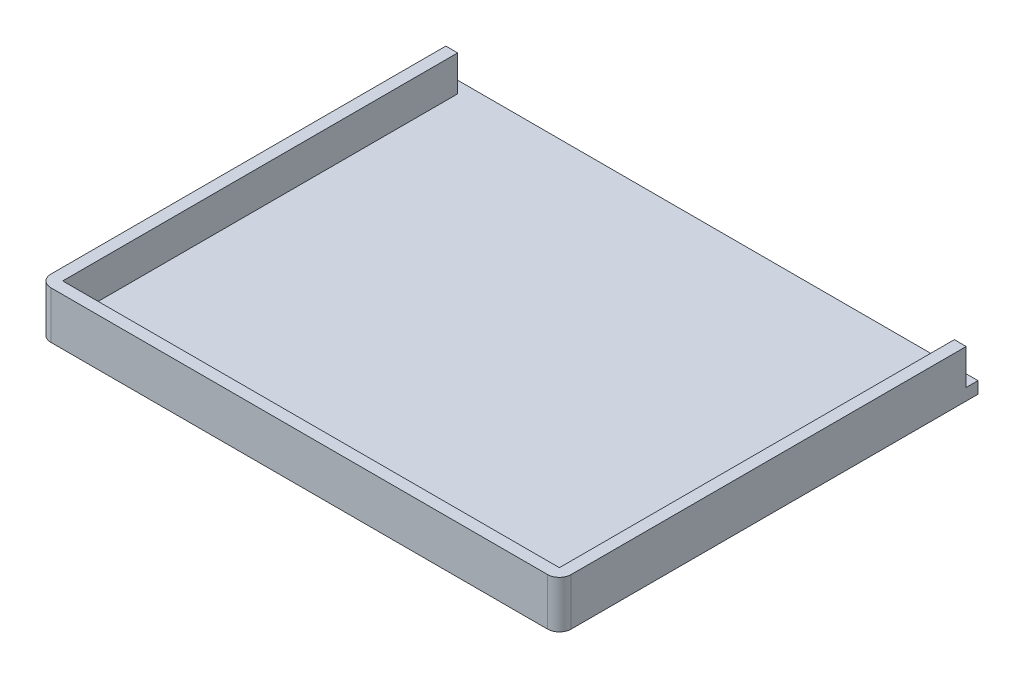
ISO-10303-21;
HEADER;
FILE_DESCRIPTION(('STEP AP214'),'2;1');
FILE_NAME('part.step','',(''),(''),'','','');
FILE_SCHEMA(('AUTOMOTIVE_DESIGN { 1 0 10303 214 1 1 1 1 }'));
ENDSEC;
DATA;
#1=APPLICATION_CONTEXT('core data for automotive mechanical design processes');
#2=APPLICATION_PROTOCOL_DEFINITION('international standard','automotive_design',2000,#1);
#3=PRODUCT_CONTEXT('',#1,'mechanical');
#4=PRODUCT('Part','Part','',(#3));
#5=PRODUCT_RELATED_PRODUCT_CATEGORY('part','',(#4));
#6=PRODUCT_DEFINITION_FORMATION('','',#4);
#7=PRODUCT_DEFINITION_CONTEXT('part definition',#1,'design');
#8=PRODUCT_DEFINITION('design','',#6,#7);
#9=PRODUCT_DEFINITION_SHAPE('','',#8);
#10=(LENGTH_UNIT() NAMED_UNIT(*) SI_UNIT(.MILLI.,.METRE.));
#11=(NAMED_UNIT(*) PLANE_ANGLE_UNIT() SI_UNIT($,.RADIAN.));
#12=(NAMED_UNIT(*) SI_UNIT($,.STERADIAN.) SOLID_ANGLE_UNIT());
#13=UNCERTAINTY_MEASURE_WITH_UNIT(LENGTH_MEASURE(1.E-05),#10,'distance_accuracy_value','');
#14=(GEOMETRIC_REPRESENTATION_CONTEXT(3) GLOBAL_UNCERTAINTY_ASSIGNED_CONTEXT((#13)) GLOBAL_UNIT_ASSIGNED_CONTEXT((#10,
#11,#12)) REPRESENTATION_CONTEXT('',''));
#15=CARTESIAN_POINT('',(0.,0.,0.));
#16=DIRECTION('',(0.,0.,1.));
#17=DIRECTION('',(1.,0.,0.));
#18=AXIS2_PLACEMENT_3D('',#15,#16,#17);
#19=CARTESIAN_POINT('',(110.,5.,-88.5));
#20=DIRECTION('',(-1.,0.,0.));
#21=DIRECTION('',(0.,0.,1.));
#22=AXIS2_PLACEMENT_3D('',#19,#20,#21);
#23=PLANE('',#22);
#24=DIRECTION('',(0.,0.,-1.));
#25=VECTOR('',#24,1.);
#26=CARTESIAN_POINT('',(110.,5.,-88.5));
#27=LINE('',#26,#25);
#28=CARTESIAN_POINT('',(110.,5.,-83.5));
#29=VERTEX_POINT('',#28);
#30=CARTESIAN_POINT('',(110.,5.,-88.5));
#31=VERTEX_POINT('',#30);
#32=EDGE_CURVE('E220',#29,#31,#27,.T.);
#33=ORIENTED_EDGE('',*,*,#32,.F.);
#34=DIRECTION('',(0.,-1.,0.));
#35=VECTOR('',#34,1.);
#36=CARTESIAN_POINT('',(110.,20.,-83.5));
#37=LINE('',#36,#35);
#38=CARTESIAN_POINT('',(110.,20.,-83.5));
#39=VERTEX_POINT('',#38);
#40=EDGE_CURVE('E215',#39,#29,#37,.T.);
#41=ORIENTED_EDGE('',*,*,#40,.F.);
#42=DIRECTION('',(0.,0.,-1.));
#43=VECTOR('',#42,1.);
#44=CARTESIAN_POINT('',(110.,20.,83.5));
#45=LINE('',#44,#43);
#46=CARTESIAN_POINT('',(110.,20.,83.5));
#47=VERTEX_POINT('',#46);
#48=EDGE_CURVE('E164',#47,#39,#45,.T.);
#49=ORIENTED_EDGE('',*,*,#48,.F.);
#50=DIRECTION('',(0.,-1.,0.));
#51=VECTOR('',#50,1.);
#52=CARTESIAN_POINT('',(110.,5.,83.5));
#53=LINE('',#52,#51);
#54=CARTESIAN_POINT('',(110.,0.,83.5));
#55=VERTEX_POINT('',#54);
#56=EDGE_CURVE('E249',#47,#55,#53,.T.);
#57=ORIENTED_EDGE('',*,*,#56,.T.);
#58=DIRECTION('',(0.,0.,-1.));
#59=VECTOR('',#58,1.);
#60=CARTESIAN_POINT('',(110.,0.,-88.5));
#61=LINE('',#60,#59);
#62=CARTESIAN_POINT('',(110.,0.,-88.5));
#63=VERTEX_POINT('',#62);
#64=EDGE_CURVE('E219',#55,#63,#61,.T.);
#65=ORIENTED_EDGE('',*,*,#64,.T.);
#66=DIRECTION('',(0.,-1.,0.));
#67=VECTOR('',#66,1.);
#68=CARTESIAN_POINT('',(110.,5.,-88.5));
#69=LINE('',#68,#67);
#70=EDGE_CURVE('E245',#31,#63,#69,.T.);
#71=ORIENTED_EDGE('',*,*,#70,.F.);
#72=EDGE_LOOP('',(#33,#41,#49,#57,#65,#71));
#73=FACE_BOUND('',#72,.T.);
#74=ADVANCED_FACE('F42',(#73),#23,.F.);
#75=CARTESIAN_POINT('',(-110.,5.,-88.5));
#76=DIRECTION('',(0.,0.,1.));
#77=DIRECTION('',(1.,0.,0.));
#78=AXIS2_PLACEMENT_3D('',#75,#76,#77);
#79=PLANE('',#78);
#80=DIRECTION('',(-1.,0.,0.));
#81=VECTOR('',#80,1.);
#82=CARTESIAN_POINT('',(-110.,0.,-88.5));
#83=LINE('',#82,#81);
#84=CARTESIAN_POINT('',(-110.,0.,-88.5));
#85=VERTEX_POINT('',#84);
#86=EDGE_CURVE('E233',#63,#85,#83,.T.);
#87=ORIENTED_EDGE('',*,*,#86,.T.);
#88=DIRECTION('',(0.,-1.,0.));
#89=VECTOR('',#88,1.);
#90=CARTESIAN_POINT('',(-110.,5.,-88.5));
#91=LINE('',#90,#89);
#92=CARTESIAN_POINT('',(-110.,5.,-88.5));
#93=VERTEX_POINT('',#92);
#94=EDGE_CURVE('E230',#93,#85,#91,.T.);
#95=ORIENTED_EDGE('',*,*,#94,.F.);
#96=DIRECTION('',(-1.,0.,0.));
#97=VECTOR('',#96,1.);
#98=CARTESIAN_POINT('',(-110.,5.,-88.5));
#99=LINE('',#98,#97);
#100=EDGE_CURVE('E223',#31,#93,#99,.T.);
#101=ORIENTED_EDGE('',*,*,#100,.F.);
#102=ORIENTED_EDGE('',*,*,#70,.T.);
#103=EDGE_LOOP('',(#87,#95,#101,#102));
#104=FACE_BOUND('',#103,.T.);
#105=ADVANCED_FACE('F295',(#104),#79,.F.);
#106=CARTESIAN_POINT('',(-110.,5.,-88.5));
#107=DIRECTION('',(1.,0.,0.));
#108=DIRECTION('',(0.,0.,-1.));
#109=AXIS2_PLACEMENT_3D('',#106,#107,#108);
#110=PLANE('',#109);
#111=DIRECTION('',(0.,0.,1.));
#112=VECTOR('',#111,1.);
#113=CARTESIAN_POINT('',(-110.,0.,-88.5));
#114=LINE('',#113,#112);
#115=CARTESIAN_POINT('',(-110.,0.,83.5));
#116=VERTEX_POINT('',#115);
#117=EDGE_CURVE('E236',#85,#116,#114,.T.);
#118=ORIENTED_EDGE('',*,*,#117,.T.);
#119=DIRECTION('',(0.,-1.,0.));
#120=VECTOR('',#119,1.);
#121=CARTESIAN_POINT('',(-110.,5.,83.5));
#122=LINE('',#121,#120);
#123=CARTESIAN_POINT('',(-110.,20.,83.5));
#124=VERTEX_POINT('',#123);
#125=EDGE_CURVE('E11',#116,#124,#122,.F.);
#126=ORIENTED_EDGE('',*,*,#125,.T.);
#127=DIRECTION('',(0.,0.,1.));
#128=VECTOR('',#127,1.);
#129=CARTESIAN_POINT('',(-110.,20.,-83.4999999999999));
#130=LINE('',#129,#128);
#131=CARTESIAN_POINT('',(-110.,20.,-83.4999999999999));
#132=VERTEX_POINT('',#131);
#133=EDGE_CURVE('E154',#132,#124,#130,.T.);
#134=ORIENTED_EDGE('',*,*,#133,.F.);
#135=DIRECTION('',(0.,-1.,0.));
#136=VECTOR('',#135,1.);
#137=CARTESIAN_POINT('',(-110.,20.,-83.4999999999999));
#138=LINE('',#137,#136);
#139=CARTESIAN_POINT('',(-110.,5.,-83.4999999999999));
#140=VERTEX_POINT('',#139);
#141=EDGE_CURVE('E184',#132,#140,#138,.T.);
#142=ORIENTED_EDGE('',*,*,#141,.T.);
#143=DIRECTION('',(0.,0.,1.));
#144=VECTOR('',#143,1.);
#145=CARTESIAN_POINT('',(-110.,5.,-88.5));
#146=LINE('',#145,#144);
#147=EDGE_CURVE('E227',#93,#140,#146,.T.);
#148=ORIENTED_EDGE('',*,*,#147,.F.);
#149=ORIENTED_EDGE('',*,*,#94,.T.);
#150=EDGE_LOOP('',(#118,#126,#134,#142,#148,#149));
#151=FACE_BOUND('',#150,.T.);
#152=ADVANCED_FACE('F290',(#151),#110,.F.);
#153=CARTESIAN_POINT('',(-110.,5.,88.5));
#154=DIRECTION('',(0.,0.,-1.));
#155=DIRECTION('',(-1.,0.,0.));
#156=AXIS2_PLACEMENT_3D('',#153,#154,#155);
#157=PLANE('',#156);
#158=DIRECTION('',(1.,0.,0.));
#159=VECTOR('',#158,1.);
#160=CARTESIAN_POINT('',(-110.,0.,88.5));
#161=LINE('',#160,#159);
#162=CARTESIAN_POINT('',(-105.,0.,88.5));
#163=VERTEX_POINT('',#162);
#164=CARTESIAN_POINT('',(105.,0.,88.5));
#165=VERTEX_POINT('',#164);
#166=EDGE_CURVE('E224',#163,#165,#161,.T.);
#167=ORIENTED_EDGE('',*,*,#166,.T.);
#168=DIRECTION('',(0.,-1.,0.));
#169=VECTOR('',#168,1.);
#170=CARTESIAN_POINT('',(105.,5.,88.5));
#171=LINE('',#170,#169);
#172=CARTESIAN_POINT('',(105.,20.,88.5));
#173=VERTEX_POINT('',#172);
#174=EDGE_CURVE('E51',#165,#173,#171,.F.);
#175=ORIENTED_EDGE('',*,*,#174,.T.);
#176=DIRECTION('',(1.,0.,0.));
#177=VECTOR('',#176,1.);
#178=CARTESIAN_POINT('',(-105.,20.,88.5));
#179=LINE('',#178,#177);
#180=CARTESIAN_POINT('',(-105.,20.,88.5));
#181=VERTEX_POINT('',#180);
#182=EDGE_CURVE('E142',#181,#173,#179,.T.);
#183=ORIENTED_EDGE('',*,*,#182,.F.);
#184=DIRECTION('',(0.,-1.,0.));
#185=VECTOR('',#184,1.);
#186=CARTESIAN_POINT('',(-105.,5.,88.5));
#187=LINE('',#186,#185);
#188=EDGE_CURVE('E129',#181,#163,#187,.T.);
#189=ORIENTED_EDGE('',*,*,#188,.T.);
#190=EDGE_LOOP('',(#167,#175,#183,#189));
#191=FACE_BOUND('',#190,.T.);
#192=ADVANCED_FACE('F143',(#191),#157,.F.);
#193=CARTESIAN_POINT('',(0.,5.,0.));
#194=DIRECTION('',(0.,1.,0.));
#195=DIRECTION('',(0.,0.,1.));
#196=AXIS2_PLACEMENT_3D('',#193,#194,#195);
#197=PLANE('',#196);
#198=DIRECTION('',(-1.,0.,0.));
#199=VECTOR('',#198,1.);
#200=CARTESIAN_POINT('',(-105.,5.,-83.4999999999999));
#201=LINE('',#200,#199);
#202=CARTESIAN_POINT('',(-105.,5.,-83.4999999999999));
#203=VERTEX_POINT('',#202);
#204=EDGE_CURVE('E58',#203,#140,#201,.T.);
#205=ORIENTED_EDGE('',*,*,#204,.F.);
#206=DIRECTION('',(0.,0.,-1.));
#207=VECTOR('',#206,1.);
#208=CARTESIAN_POINT('',(-105.,5.,-83.4999999999999));
#209=LINE('',#208,#207);
#210=CARTESIAN_POINT('',(-105.,5.,83.5));
#211=VERTEX_POINT('',#210);
#212=EDGE_CURVE('E62',#211,#203,#209,.T.);
#213=ORIENTED_EDGE('',*,*,#212,.F.);
#214=DIRECTION('',(-1.,0.,0.));
#215=VECTOR('',#214,1.);
#216=CARTESIAN_POINT('',(-105.,5.,83.5));
#217=LINE('',#216,#215);
#218=CARTESIAN_POINT('',(105.,5.,83.5));
#219=VERTEX_POINT('',#218);
#220=EDGE_CURVE('E193',#219,#211,#217,.T.);
#221=ORIENTED_EDGE('',*,*,#220,.F.);
#222=DIRECTION('',(0.,0.,1.));
#223=VECTOR('',#222,1.);
#224=CARTESIAN_POINT('',(105.,5.,83.5));
#225=LINE('',#224,#223);
#226=CARTESIAN_POINT('',(105.,5.,-83.5));
#227=VERTEX_POINT('',#226);
#228=EDGE_CURVE('E189',#227,#219,#225,.T.);
#229=ORIENTED_EDGE('',*,*,#228,.F.);
#230=DIRECTION('',(-1.,0.,0.));
#231=VECTOR('',#230,1.);
#232=CARTESIAN_POINT('',(110.,5.,-83.5));
#233=LINE('',#232,#231);
#234=EDGE_CURVE('E185',#29,#227,#233,.T.);
#235=ORIENTED_EDGE('',*,*,#234,.F.);
#236=ORIENTED_EDGE('',*,*,#32,.T.);
#237=ORIENTED_EDGE('',*,*,#100,.T.);
#238=ORIENTED_EDGE('',*,*,#147,.T.);
#239=EDGE_LOOP('',(#205,#213,#221,#229,#235,#236,#237,#238));
#240=FACE_BOUND('',#239,.T.);
#241=ADVANCED_FACE('F296',(#240),#197,.T.);
#242=CARTESIAN_POINT('',(0.,0.,0.));
#243=DIRECTION('',(0.,1.,0.));
#244=DIRECTION('',(0.,0.,1.));
#245=AXIS2_PLACEMENT_3D('',#242,#243,#244);
#246=PLANE('',#245);
#247=ORIENTED_EDGE('',*,*,#64,.F.);
#248=CARTESIAN_POINT('',(105.,0.,83.5));
#249=DIRECTION('',(0.,1.,0.));
#250=DIRECTION('',(0.,0.,1.));
#251=AXIS2_PLACEMENT_3D('',#248,#249,#250);
#252=CIRCLE('',#251,5.);
#253=EDGE_CURVE('E139',#55,#165,#252,.F.);
#254=ORIENTED_EDGE('',*,*,#253,.T.);
#255=ORIENTED_EDGE('',*,*,#166,.F.);
#256=CARTESIAN_POINT('',(-105.,0.,83.5));
#257=DIRECTION('',(0.,1.,0.));
#258=DIRECTION('',(0.,0.,1.));
#259=AXIS2_PLACEMENT_3D('',#256,#257,#258);
#260=CIRCLE('',#259,5.);
#261=EDGE_CURVE('E134',#163,#116,#260,.F.);
#262=ORIENTED_EDGE('',*,*,#261,.T.);
#263=ORIENTED_EDGE('',*,*,#117,.F.);
#264=ORIENTED_EDGE('',*,*,#86,.F.);
#265=EDGE_LOOP('',(#247,#254,#255,#262,#263,#264));
#266=FACE_BOUND('',#265,.T.);
#267=ADVANCED_FACE('F259',(#266),#246,.F.);
#268=CARTESIAN_POINT('',(105.,5.,83.5));
#269=DIRECTION('',(0.,-1.,0.));
#270=DIRECTION('',(0.,0.,-1.));
#271=AXIS2_PLACEMENT_3D('',#268,#269,#270);
#272=CYLINDRICAL_SURFACE('',#271,5.);
#273=ORIENTED_EDGE('',*,*,#56,.F.);
#274=CARTESIAN_POINT('',(105.,20.,83.5));
#275=DIRECTION('',(0.,1.,0.));
#276=DIRECTION('',(0.,0.,1.));
#277=AXIS2_PLACEMENT_3D('',#274,#275,#276);
#278=CIRCLE('',#277,5.);
#279=EDGE_CURVE('E149',#173,#47,#278,.T.);
#280=ORIENTED_EDGE('',*,*,#279,.F.);
#281=ORIENTED_EDGE('',*,*,#174,.F.);
#282=ORIENTED_EDGE('',*,*,#253,.F.);
#283=EDGE_LOOP('',(#273,#280,#281,#282));
#284=FACE_BOUND('',#283,.T.);
#285=ADVANCED_FACE('F262',(#284),#272,.T.);
#286=CARTESIAN_POINT('',(-105.,5.,83.5));
#287=DIRECTION('',(0.,-1.,0.));
#288=DIRECTION('',(0.,0.,-1.));
#289=AXIS2_PLACEMENT_3D('',#286,#287,#288);
#290=CYLINDRICAL_SURFACE('',#289,5.);
#291=ORIENTED_EDGE('',*,*,#188,.F.);
#292=CARTESIAN_POINT('',(-105.,20.,83.5));
#293=DIRECTION('',(0.,1.,0.));
#294=DIRECTION('',(0.,0.,1.));
#295=AXIS2_PLACEMENT_3D('',#292,#293,#294);
#296=CIRCLE('',#295,5.);
#297=EDGE_CURVE('E133',#124,#181,#296,.T.);
#298=ORIENTED_EDGE('',*,*,#297,.F.);
#299=ORIENTED_EDGE('',*,*,#125,.F.);
#300=ORIENTED_EDGE('',*,*,#261,.F.);
#301=EDGE_LOOP('',(#291,#298,#299,#300));
#302=FACE_BOUND('',#301,.T.);
#303=ADVANCED_FACE('F44',(#302),#290,.T.);
#304=CARTESIAN_POINT('',(110.,20.,-83.5));
#305=DIRECTION('',(0.,0.,1.));
#306=DIRECTION('',(1.,0.,0.));
#307=AXIS2_PLACEMENT_3D('',#304,#305,#306);
#308=PLANE('',#307);
#309=ORIENTED_EDGE('',*,*,#234,.T.);
#310=DIRECTION('',(0.,-1.,0.));
#311=VECTOR('',#310,1.);
#312=CARTESIAN_POINT('',(105.,20.,-83.5));
#313=LINE('',#312,#311);
#314=CARTESIAN_POINT('',(105.,20.,-83.5));
#315=VERTEX_POINT('',#314);
#316=EDGE_CURVE('E211',#315,#227,#313,.T.);
#317=ORIENTED_EDGE('',*,*,#316,.F.);
#318=DIRECTION('',(-1.,0.,0.));
#319=VECTOR('',#318,1.);
#320=CARTESIAN_POINT('',(110.,20.,-83.5));
#321=LINE('',#320,#319);
#322=EDGE_CURVE('E167',#39,#315,#321,.T.);
#323=ORIENTED_EDGE('',*,*,#322,.F.);
#324=ORIENTED_EDGE('',*,*,#40,.T.);
#325=EDGE_LOOP('',(#309,#317,#323,#324));
#326=FACE_BOUND('',#325,.T.);
#327=ADVANCED_FACE('F271',(#326),#308,.F.);
#328=CARTESIAN_POINT('',(105.,20.,83.5));
#329=DIRECTION('',(1.,0.,0.));
#330=DIRECTION('',(0.,0.,-1.));
#331=AXIS2_PLACEMENT_3D('',#328,#329,#330);
#332=PLANE('',#331);
#333=ORIENTED_EDGE('',*,*,#228,.T.);
#334=DIRECTION('',(0.,-1.,0.));
#335=VECTOR('',#334,1.);
#336=CARTESIAN_POINT('',(105.,20.,83.5));
#337=LINE('',#336,#335);
#338=CARTESIAN_POINT('',(105.,20.,83.5));
#339=VERTEX_POINT('',#338);
#340=EDGE_CURVE('E207',#339,#219,#337,.T.);
#341=ORIENTED_EDGE('',*,*,#340,.F.);
#342=DIRECTION('',(0.,0.,1.));
#343=VECTOR('',#342,1.);
#344=CARTESIAN_POINT('',(105.,20.,83.5));
#345=LINE('',#344,#343);
#346=EDGE_CURVE('E170',#315,#339,#345,.T.);
#347=ORIENTED_EDGE('',*,*,#346,.F.);
#348=ORIENTED_EDGE('',*,*,#316,.T.);
#349=EDGE_LOOP('',(#333,#341,#347,#348));
#350=FACE_BOUND('',#349,.T.);
#351=ADVANCED_FACE('F277',(#350),#332,.F.);
#352=CARTESIAN_POINT('',(-105.,20.,83.5));
#353=DIRECTION('',(0.,0.,1.));
#354=DIRECTION('',(1.,0.,0.));
#355=AXIS2_PLACEMENT_3D('',#352,#353,#354);
#356=PLANE('',#355);
#357=ORIENTED_EDGE('',*,*,#220,.T.);
#358=DIRECTION('',(0.,-1.,0.));
#359=VECTOR('',#358,1.);
#360=CARTESIAN_POINT('',(-105.,20.,83.5));
#361=LINE('',#360,#359);
#362=CARTESIAN_POINT('',(-105.,20.,83.5));
#363=VERTEX_POINT('',#362);
#364=EDGE_CURVE('E203',#363,#211,#361,.T.);
#365=ORIENTED_EDGE('',*,*,#364,.F.);
#366=DIRECTION('',(-1.,0.,0.));
#367=VECTOR('',#366,1.);
#368=CARTESIAN_POINT('',(-105.,20.,83.5));
#369=LINE('',#368,#367);
#370=EDGE_CURVE('E173',#339,#363,#369,.T.);
#371=ORIENTED_EDGE('',*,*,#370,.F.);
#372=ORIENTED_EDGE('',*,*,#340,.T.);
#373=EDGE_LOOP('',(#357,#365,#371,#372));
#374=FACE_BOUND('',#373,.T.);
#375=ADVANCED_FACE('F279',(#374),#356,.F.);
#376=CARTESIAN_POINT('',(-105.,20.,-83.4999999999999));
#377=DIRECTION('',(-1.,0.,0.));
#378=DIRECTION('',(0.,0.,1.));
#379=AXIS2_PLACEMENT_3D('',#376,#377,#378);
#380=PLANE('',#379);
#381=ORIENTED_EDGE('',*,*,#212,.T.);
#382=DIRECTION('',(0.,-1.,0.));
#383=VECTOR('',#382,1.);
#384=CARTESIAN_POINT('',(-105.,20.,-83.4999999999999));
#385=LINE('',#384,#383);
#386=CARTESIAN_POINT('',(-105.,20.,-83.4999999999999));
#387=VERTEX_POINT('',#386);
#388=EDGE_CURVE('E199',#387,#203,#385,.T.);
#389=ORIENTED_EDGE('',*,*,#388,.F.);
#390=DIRECTION('',(0.,0.,-1.));
#391=VECTOR('',#390,1.);
#392=CARTESIAN_POINT('',(-105.,20.,-83.4999999999999));
#393=LINE('',#392,#391);
#394=EDGE_CURVE('E176',#363,#387,#393,.T.);
#395=ORIENTED_EDGE('',*,*,#394,.F.);
#396=ORIENTED_EDGE('',*,*,#364,.T.);
#397=EDGE_LOOP('',(#381,#389,#395,#396));
#398=FACE_BOUND('',#397,.T.);
#399=ADVANCED_FACE('F283',(#398),#380,.F.);
#400=CARTESIAN_POINT('',(-105.,20.,-83.4999999999999));
#401=DIRECTION('',(0.,0.,1.));
#402=DIRECTION('',(1.,0.,0.));
#403=AXIS2_PLACEMENT_3D('',#400,#401,#402);
#404=PLANE('',#403);
#405=ORIENTED_EDGE('',*,*,#204,.T.);
#406=ORIENTED_EDGE('',*,*,#141,.F.);
#407=DIRECTION('',(-1.,0.,0.));
#408=VECTOR('',#407,1.);
#409=CARTESIAN_POINT('',(-105.,20.,-83.4999999999999));
#410=LINE('',#409,#408);
#411=EDGE_CURVE('E179',#387,#132,#410,.T.);
#412=ORIENTED_EDGE('',*,*,#411,.F.);
#413=ORIENTED_EDGE('',*,*,#388,.T.);
#414=EDGE_LOOP('',(#405,#406,#412,#413));
#415=FACE_BOUND('',#414,.T.);
#416=ADVANCED_FACE('F287',(#415),#404,.F.);
#417=CARTESIAN_POINT('',(-105.,20.,83.5));
#418=DIRECTION('',(0.,1.,0.));
#419=DIRECTION('',(0.,0.,1.));
#420=AXIS2_PLACEMENT_3D('',#417,#418,#419);
#421=PLANE('',#420);
#422=ORIENTED_EDGE('',*,*,#297,.T.);
#423=ORIENTED_EDGE('',*,*,#182,.T.);
#424=ORIENTED_EDGE('',*,*,#279,.T.);
#425=ORIENTED_EDGE('',*,*,#48,.T.);
#426=ORIENTED_EDGE('',*,*,#322,.T.);
#427=ORIENTED_EDGE('',*,*,#346,.T.);
#428=ORIENTED_EDGE('',*,*,#370,.T.);
#429=ORIENTED_EDGE('',*,*,#394,.T.);
#430=ORIENTED_EDGE('',*,*,#411,.T.);
#431=ORIENTED_EDGE('',*,*,#133,.T.);
#432=EDGE_LOOP('',(#422,#423,#424,#425,#426,#427,#428,#429,#430,#431));
#433=FACE_BOUND('',#432,.T.);
#434=ADVANCED_FACE('F152',(#433),#421,.T.);
#435=CLOSED_SHELL('',(#74,#105,#152,#192,#241,#267,#285,#303,#327,#351,#375,#399,#416,#434));
#436=MANIFOLD_SOLID_BREP('B2',#435);
#437=ADVANCED_BREP_SHAPE_REPRESENTATION('',(#18,#436),#14);
#438=SHAPE_DEFINITION_REPRESENTATION(#9,#437);
ENDSEC;
END-ISO-10303-21;
